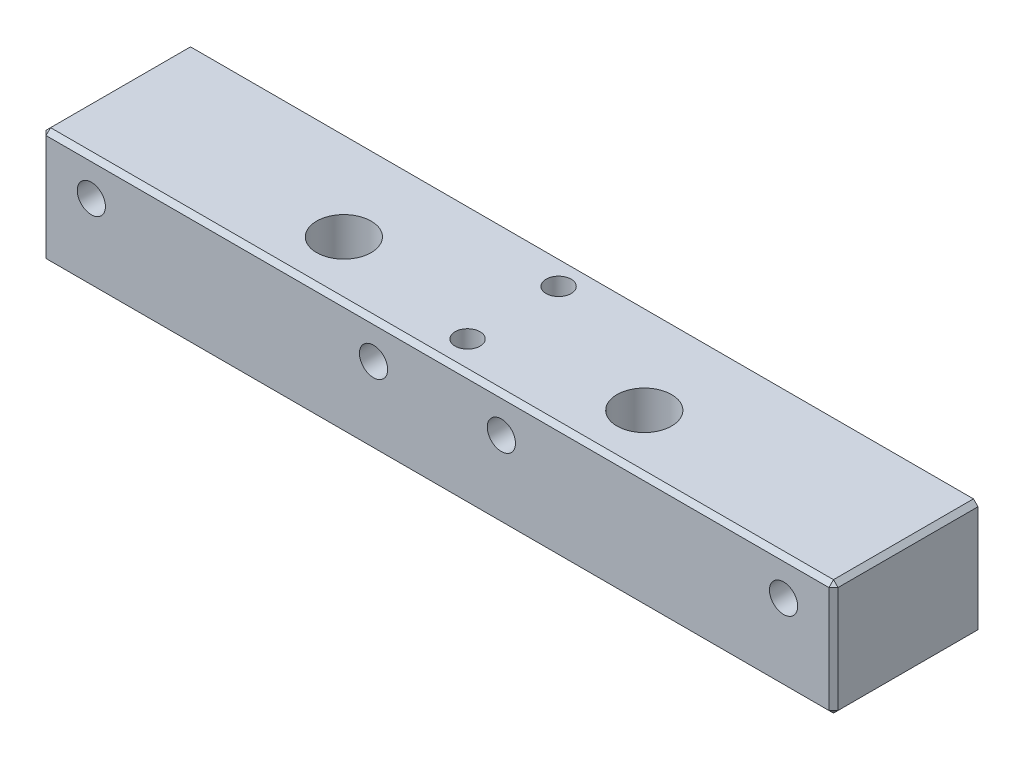
ISO-10303-21;
HEADER;
FILE_DESCRIPTION(('STEP AP214'),'2;1');
FILE_NAME('part.step','',(''),(''),'','','');
FILE_SCHEMA(('AUTOMOTIVE_DESIGN { 1 0 10303 214 1 1 1 1 }'));
ENDSEC;
DATA;
#1=APPLICATION_CONTEXT('core data for automotive mechanical design processes');
#2=APPLICATION_PROTOCOL_DEFINITION('international standard','automotive_design',2000,#1);
#3=PRODUCT_CONTEXT('',#1,'mechanical');
#4=PRODUCT('Part','Part','',(#3));
#5=PRODUCT_RELATED_PRODUCT_CATEGORY('part','',(#4));
#6=PRODUCT_DEFINITION_FORMATION('','',#4);
#7=PRODUCT_DEFINITION_CONTEXT('part definition',#1,'design');
#8=PRODUCT_DEFINITION('design','',#6,#7);
#9=PRODUCT_DEFINITION_SHAPE('','',#8);
#10=(LENGTH_UNIT() NAMED_UNIT(*) SI_UNIT(.MILLI.,.METRE.));
#11=(NAMED_UNIT(*) PLANE_ANGLE_UNIT() SI_UNIT($,.RADIAN.));
#12=(NAMED_UNIT(*) SI_UNIT($,.STERADIAN.) SOLID_ANGLE_UNIT());
#13=UNCERTAINTY_MEASURE_WITH_UNIT(LENGTH_MEASURE(1.E-05),#10,'distance_accuracy_value','');
#14=(GEOMETRIC_REPRESENTATION_CONTEXT(3) GLOBAL_UNCERTAINTY_ASSIGNED_CONTEXT((#13)) GLOBAL_UNIT_ASSIGNED_CONTEXT((#10,
#11,#12)) REPRESENTATION_CONTEXT('',''));
#15=CARTESIAN_POINT('',(0.,0.,0.));
#16=DIRECTION('',(0.,0.,1.));
#17=DIRECTION('',(1.,0.,0.));
#18=AXIS2_PLACEMENT_3D('',#15,#16,#17);
#19=CARTESIAN_POINT('',(-43.5,-6.35,7.9375));
#20=DIRECTION('',(0.,1.,0.));
#21=DIRECTION('',(0.,0.,1.));
#22=AXIS2_PLACEMENT_3D('',#19,#20,#21);
#23=PLANE('',#22);
#24=CARTESIAN_POINT('',(0.,-6.35,-5.3675));
#25=DIRECTION('',(0.,1.,0.));
#26=DIRECTION('',(0.,0.,1.));
#27=AXIS2_PLACEMENT_3D('',#24,#25,#26);
#28=CIRCLE('',#27,1.375);
#29=CARTESIAN_POINT('',(0.,-6.35,-3.9925));
#30=VERTEX_POINT('',#29);
#31=EDGE_CURVE('E340',#30,#30,#28,.T.);
#32=ORIENTED_EDGE('',*,*,#31,.T.);
#33=EDGE_LOOP('',(#32));
#34=FACE_BOUND('',#33,.T.);
#35=CARTESIAN_POINT('',(-37.,-6.35,-0.367500000000001));
#36=DIRECTION('',(0.,1.,0.));
#37=DIRECTION('',(0.,0.,1.));
#38=AXIS2_PLACEMENT_3D('',#35,#36,#37);
#39=CIRCLE('',#38,1.375);
#40=CARTESIAN_POINT('',(-37.,-6.35,1.0075));
#41=VERTEX_POINT('',#40);
#42=EDGE_CURVE('E349',#41,#41,#39,.T.);
#43=ORIENTED_EDGE('',*,*,#42,.T.);
#44=EDGE_LOOP('',(#43));
#45=FACE_BOUND('',#44,.T.);
#46=DIRECTION('',(1.,0.,0.));
#47=VECTOR('',#46,1.);
#48=CARTESIAN_POINT('',(-43.5,-6.35,-7.9375));
#49=LINE('',#48,#47);
#50=CARTESIAN_POINT('',(-43.,-6.34999999999999,-7.9375));
#51=VERTEX_POINT('',#50);
#52=CARTESIAN_POINT('',(43.,-6.35,-7.9375));
#53=VERTEX_POINT('',#52);
#54=EDGE_CURVE('E145',#51,#53,#49,.T.);
#55=ORIENTED_EDGE('',*,*,#54,.T.);
#56=DIRECTION('',(0.,0.,1.));
#57=VECTOR('',#56,1.);
#58=CARTESIAN_POINT('',(43.,-6.35,7.9375));
#59=LINE('',#58,#57);
#60=CARTESIAN_POINT('',(43.,-6.35,7.4375));
#61=VERTEX_POINT('',#60);
#62=EDGE_CURVE('E166',#53,#61,#59,.T.);
#63=ORIENTED_EDGE('',*,*,#62,.T.);
#64=DIRECTION('',(-1.,0.,0.));
#65=VECTOR('',#64,1.);
#66=CARTESIAN_POINT('',(-43.5,-6.35,7.4375));
#67=LINE('',#66,#65);
#68=CARTESIAN_POINT('',(-43.,-6.35,7.4375));
#69=VERTEX_POINT('',#68);
#70=EDGE_CURVE('E162',#61,#69,#67,.T.);
#71=ORIENTED_EDGE('',*,*,#70,.T.);
#72=DIRECTION('',(0.,0.,-1.));
#73=VECTOR('',#72,1.);
#74=CARTESIAN_POINT('',(-43.,-6.35,7.9375));
#75=LINE('',#74,#73);
#76=EDGE_CURVE('E164',#69,#51,#75,.T.);
#77=ORIENTED_EDGE('',*,*,#76,.T.);
#78=EDGE_LOOP('',(#55,#63,#71,#77));
#79=FACE_BOUND('',#78,.T.);
#80=CARTESIAN_POINT('',(-16.5,-6.35,1.7175));
#81=DIRECTION('',(0.,1.,0.));
#82=DIRECTION('',(0.,0.,1.));
#83=AXIS2_PLACEMENT_3D('',#80,#81,#82);
#84=CIRCLE('',#83,3.);
#85=CARTESIAN_POINT('',(-16.5,-6.35,4.7175));
#86=VERTEX_POINT('',#85);
#87=EDGE_CURVE('E242',#86,#86,#84,.T.);
#88=ORIENTED_EDGE('',*,*,#87,.T.);
#89=EDGE_LOOP('',(#88));
#90=FACE_BOUND('',#89,.T.);
#91=CARTESIAN_POINT('',(16.5,-6.35,1.7175));
#92=DIRECTION('',(0.,1.,0.));
#93=DIRECTION('',(0.,0.,1.));
#94=AXIS2_PLACEMENT_3D('',#91,#92,#93);
#95=CIRCLE('',#94,3.);
#96=CARTESIAN_POINT('',(16.5,-6.35,4.7175));
#97=VERTEX_POINT('',#96);
#98=EDGE_CURVE('E147',#97,#97,#95,.T.);
#99=ORIENTED_EDGE('',*,*,#98,.T.);
#100=EDGE_LOOP('',(#99));
#101=FACE_BOUND('',#100,.T.);
#102=CARTESIAN_POINT('',(37.,-6.35,-0.36750000000001));
#103=DIRECTION('',(0.,1.,0.));
#104=DIRECTION('',(0.,0.,-1.));
#105=AXIS2_PLACEMENT_3D('',#102,#103,#104);
#106=CIRCLE('',#105,1.375);
#107=CARTESIAN_POINT('',(37.,-6.35,-1.74250000000001));
#108=VERTEX_POINT('',#107);
#109=EDGE_CURVE('E345',#108,#108,#106,.T.);
#110=ORIENTED_EDGE('',*,*,#109,.T.);
#111=EDGE_LOOP('',(#110));
#112=FACE_BOUND('',#111,.T.);
#113=CARTESIAN_POINT('',(0.,-6.35,4.6325));
#114=DIRECTION('',(0.,1.,0.));
#115=DIRECTION('',(0.,0.,1.));
#116=AXIS2_PLACEMENT_3D('',#113,#114,#115);
#117=CIRCLE('',#116,1.375);
#118=CARTESIAN_POINT('',(0.,-6.35,6.0075));
#119=VERTEX_POINT('',#118);
#120=EDGE_CURVE('E334',#119,#119,#117,.T.);
#121=ORIENTED_EDGE('',*,*,#120,.T.);
#122=EDGE_LOOP('',(#121));
#123=FACE_BOUND('',#122,.T.);
#124=ADVANCED_FACE('F33',(#34,#45,#79,#90,#101,#112,#123),#23,.F.);
#125=CARTESIAN_POINT('',(43.5,-6.35,7.9375));
#126=DIRECTION('',(-1.,0.,0.));
#127=DIRECTION('',(0.,0.,1.));
#128=AXIS2_PLACEMENT_3D('',#125,#126,#127);
#129=PLANE('',#128);
#130=DIRECTION('',(0.,1.,0.));
#131=VECTOR('',#130,1.);
#132=CARTESIAN_POINT('',(43.5,-6.35,-7.9375));
#133=LINE('',#132,#131);
#134=CARTESIAN_POINT('',(43.5,-5.85,-7.9375));
#135=VERTEX_POINT('',#134);
#136=CARTESIAN_POINT('',(43.5,5.85,-7.9375));
#137=VERTEX_POINT('',#136);
#138=EDGE_CURVE('E142',#135,#137,#133,.T.);
#139=ORIENTED_EDGE('',*,*,#138,.T.);
#140=DIRECTION('',(0.,0.,1.));
#141=VECTOR('',#140,1.);
#142=CARTESIAN_POINT('',(43.5,5.85,7.9375));
#143=LINE('',#142,#141);
#144=CARTESIAN_POINT('',(43.5,5.85,7.4375));
#145=VERTEX_POINT('',#144);
#146=EDGE_CURVE('E119',#137,#145,#143,.T.);
#147=ORIENTED_EDGE('',*,*,#146,.T.);
#148=DIRECTION('',(0.,-1.,0.));
#149=VECTOR('',#148,1.);
#150=CARTESIAN_POINT('',(43.5,-6.35,7.4375));
#151=LINE('',#150,#149);
#152=CARTESIAN_POINT('',(43.5,-5.85,7.4375));
#153=VERTEX_POINT('',#152);
#154=EDGE_CURVE('E124',#145,#153,#151,.T.);
#155=ORIENTED_EDGE('',*,*,#154,.T.);
#156=DIRECTION('',(0.,0.,-1.));
#157=VECTOR('',#156,1.);
#158=CARTESIAN_POINT('',(43.5,-5.85,7.9375));
#159=LINE('',#158,#157);
#160=EDGE_CURVE('E159',#153,#135,#159,.T.);
#161=ORIENTED_EDGE('',*,*,#160,.T.);
#162=EDGE_LOOP('',(#139,#147,#155,#161));
#163=FACE_BOUND('',#162,.T.);
#164=ADVANCED_FACE('F256',(#163),#129,.F.);
#165=CARTESIAN_POINT('',(-43.5,6.35,7.9375));
#166=DIRECTION('',(0.,-1.,0.));
#167=DIRECTION('',(0.,0.,-1.));
#168=AXIS2_PLACEMENT_3D('',#165,#166,#167);
#169=PLANE('',#168);
#170=CARTESIAN_POINT('',(0.,6.35000000000001,-5.3675));
#171=DIRECTION('',(0.,-1.,0.));
#172=DIRECTION('',(0.,0.,-1.));
#173=AXIS2_PLACEMENT_3D('',#170,#171,#172);
#174=CIRCLE('',#173,1.375);
#175=CARTESIAN_POINT('',(0.,6.35000000000001,-6.7425));
#176=VERTEX_POINT('',#175);
#177=EDGE_CURVE('E338',#176,#176,#174,.T.);
#178=ORIENTED_EDGE('',*,*,#177,.T.);
#179=EDGE_LOOP('',(#178));
#180=FACE_BOUND('',#179,.T.);
#181=CARTESIAN_POINT('',(0.,6.35000000000001,4.6325));
#182=DIRECTION('',(0.,-1.,0.));
#183=DIRECTION('',(0.,0.,-1.));
#184=AXIS2_PLACEMENT_3D('',#181,#182,#183);
#185=CIRCLE('',#184,1.375);
#186=CARTESIAN_POINT('',(0.,6.35000000000001,3.2575));
#187=VERTEX_POINT('',#186);
#188=EDGE_CURVE('E337',#187,#187,#185,.T.);
#189=ORIENTED_EDGE('',*,*,#188,.T.);
#190=EDGE_LOOP('',(#189));
#191=FACE_BOUND('',#190,.T.);
#192=CARTESIAN_POINT('',(-16.5,6.35,1.7175));
#193=DIRECTION('',(0.,1.,0.));
#194=DIRECTION('',(0.,0.,1.));
#195=AXIS2_PLACEMENT_3D('',#192,#193,#194);
#196=CIRCLE('',#195,3.);
#197=CARTESIAN_POINT('',(-16.5,6.35,4.7175));
#198=VERTEX_POINT('',#197);
#199=EDGE_CURVE('E239',#198,#198,#196,.T.);
#200=ORIENTED_EDGE('',*,*,#199,.F.);
#201=EDGE_LOOP('',(#200));
#202=FACE_BOUND('',#201,.T.);
#203=CARTESIAN_POINT('',(16.5,6.35,1.7175));
#204=DIRECTION('',(0.,1.,0.));
#205=DIRECTION('',(0.,0.,1.));
#206=AXIS2_PLACEMENT_3D('',#203,#204,#205);
#207=CIRCLE('',#206,3.);
#208=CARTESIAN_POINT('',(16.5,6.35,4.7175));
#209=VERTEX_POINT('',#208);
#210=EDGE_CURVE('E245',#209,#209,#207,.T.);
#211=ORIENTED_EDGE('',*,*,#210,.F.);
#212=EDGE_LOOP('',(#211));
#213=FACE_BOUND('',#212,.T.);
#214=DIRECTION('',(1.,0.,0.));
#215=VECTOR('',#214,1.);
#216=CARTESIAN_POINT('',(-43.5,6.35,7.4375));
#217=LINE('',#216,#215);
#218=CARTESIAN_POINT('',(-43.,6.35,7.4375));
#219=VERTEX_POINT('',#218);
#220=CARTESIAN_POINT('',(43.,6.35,7.4375));
#221=VERTEX_POINT('',#220);
#222=EDGE_CURVE('E133',#219,#221,#217,.T.);
#223=ORIENTED_EDGE('',*,*,#222,.T.);
#224=DIRECTION('',(0.,0.,-1.));
#225=VECTOR('',#224,1.);
#226=CARTESIAN_POINT('',(43.,6.35,7.9375));
#227=LINE('',#226,#225);
#228=CARTESIAN_POINT('',(43.,6.35000000000001,-7.9375));
#229=VERTEX_POINT('',#228);
#230=EDGE_CURVE('E118',#221,#229,#227,.T.);
#231=ORIENTED_EDGE('',*,*,#230,.T.);
#232=DIRECTION('',(-1.,0.,0.));
#233=VECTOR('',#232,1.);
#234=CARTESIAN_POINT('',(-43.5,6.35,-7.9375));
#235=LINE('',#234,#233);
#236=CARTESIAN_POINT('',(-43.,6.35,-7.9375));
#237=VERTEX_POINT('',#236);
#238=EDGE_CURVE('E130',#229,#237,#235,.T.);
#239=ORIENTED_EDGE('',*,*,#238,.T.);
#240=DIRECTION('',(0.,0.,1.));
#241=VECTOR('',#240,1.);
#242=CARTESIAN_POINT('',(-43.,6.35,7.9375));
#243=LINE('',#242,#241);
#244=EDGE_CURVE('E135',#237,#219,#243,.T.);
#245=ORIENTED_EDGE('',*,*,#244,.T.);
#246=EDGE_LOOP('',(#223,#231,#239,#245));
#247=FACE_BOUND('',#246,.T.);
#248=ADVANCED_FACE('F129',(#180,#191,#202,#213,#247),#169,.F.);
#249=CARTESIAN_POINT('',(-43.5,-6.35,7.9375));
#250=DIRECTION('',(1.,0.,0.));
#251=DIRECTION('',(0.,0.,-1.));
#252=AXIS2_PLACEMENT_3D('',#249,#250,#251);
#253=PLANE('',#252);
#254=DIRECTION('',(0.,1.,0.));
#255=VECTOR('',#254,1.);
#256=CARTESIAN_POINT('',(-43.5,-6.35,7.4375));
#257=LINE('',#256,#255);
#258=CARTESIAN_POINT('',(-43.5,-5.85,7.4375));
#259=VERTEX_POINT('',#258);
#260=CARTESIAN_POINT('',(-43.5,5.85,7.4375));
#261=VERTEX_POINT('',#260);
#262=EDGE_CURVE('E168',#259,#261,#257,.T.);
#263=ORIENTED_EDGE('',*,*,#262,.T.);
#264=DIRECTION('',(0.,0.,-1.));
#265=VECTOR('',#264,1.);
#266=CARTESIAN_POINT('',(-43.5,5.85,7.9375));
#267=LINE('',#266,#265);
#268=CARTESIAN_POINT('',(-43.5,5.85,-7.9375));
#269=VERTEX_POINT('',#268);
#270=EDGE_CURVE('E172',#261,#269,#267,.T.);
#271=ORIENTED_EDGE('',*,*,#270,.T.);
#272=DIRECTION('',(0.,-1.,0.));
#273=VECTOR('',#272,1.);
#274=CARTESIAN_POINT('',(-43.5,-6.35,-7.9375));
#275=LINE('',#274,#273);
#276=CARTESIAN_POINT('',(-43.5,-5.85,-7.9375));
#277=VERTEX_POINT('',#276);
#278=EDGE_CURVE('E141',#269,#277,#275,.T.);
#279=ORIENTED_EDGE('',*,*,#278,.T.);
#280=DIRECTION('',(0.,0.,1.));
#281=VECTOR('',#280,1.);
#282=CARTESIAN_POINT('',(-43.5,-5.85,7.9375));
#283=LINE('',#282,#281);
#284=EDGE_CURVE('E170',#277,#259,#283,.T.);
#285=ORIENTED_EDGE('',*,*,#284,.T.);
#286=EDGE_LOOP('',(#263,#271,#279,#285));
#287=FACE_BOUND('',#286,.T.);
#288=ADVANCED_FACE('F255',(#287),#253,.F.);
#289=CARTESIAN_POINT('',(43.5,6.35,7.9375));
#290=DIRECTION('',(0.,0.,-1.));
#291=DIRECTION('',(-1.,0.,0.));
#292=AXIS2_PLACEMENT_3D('',#289,#290,#291);
#293=PLANE('',#292);
#294=DIRECTION('',(1.,0.,0.));
#295=VECTOR('',#294,1.);
#296=CARTESIAN_POINT('',(43.5,-5.85,7.9375));
#297=LINE('',#296,#295);
#298=CARTESIAN_POINT('',(-43.,-5.85,7.9375));
#299=VERTEX_POINT('',#298);
#300=CARTESIAN_POINT('',(43.,-5.85,7.9375));
#301=VERTEX_POINT('',#300);
#302=EDGE_CURVE('E57',#299,#301,#297,.T.);
#303=ORIENTED_EDGE('',*,*,#302,.T.);
#304=DIRECTION('',(0.,1.,0.));
#305=VECTOR('',#304,1.);
#306=CARTESIAN_POINT('',(43.,6.35,7.9375));
#307=LINE('',#306,#305);
#308=CARTESIAN_POINT('',(43.,5.85,7.9375));
#309=VERTEX_POINT('',#308);
#310=EDGE_CURVE('E11',#301,#309,#307,.T.);
#311=ORIENTED_EDGE('',*,*,#310,.T.);
#312=DIRECTION('',(-1.,0.,0.));
#313=VECTOR('',#312,1.);
#314=CARTESIAN_POINT('',(43.5,5.85,7.9375));
#315=LINE('',#314,#313);
#316=CARTESIAN_POINT('',(-43.,5.85,7.9375));
#317=VERTEX_POINT('',#316);
#318=EDGE_CURVE('E42',#309,#317,#315,.T.);
#319=ORIENTED_EDGE('',*,*,#318,.T.);
#320=DIRECTION('',(0.,-1.,0.));
#321=VECTOR('',#320,1.);
#322=CARTESIAN_POINT('',(-43.,6.35,7.9375));
#323=LINE('',#322,#321);
#324=EDGE_CURVE('E174',#317,#299,#323,.T.);
#325=ORIENTED_EDGE('',*,*,#324,.T.);
#326=EDGE_LOOP('',(#303,#311,#319,#325));
#327=FACE_BOUND('',#326,.T.);
#328=CARTESIAN_POINT('',(38.02,2.35000000000001,7.9375));
#329=DIRECTION('',(0.,0.,1.));
#330=DIRECTION('',(1.,0.,0.));
#331=AXIS2_PLACEMENT_3D('',#328,#329,#330);
#332=CIRCLE('',#331,1.55);
#333=CARTESIAN_POINT('',(39.57,2.35000000000001,7.9375));
#334=VERTEX_POINT('',#333);
#335=EDGE_CURVE('E210',#334,#334,#332,.T.);
#336=ORIENTED_EDGE('',*,*,#335,.F.);
#337=EDGE_LOOP('',(#336));
#338=FACE_BOUND('',#337,.T.);
#339=CARTESIAN_POINT('',(-7.02,2.35,7.9375));
#340=DIRECTION('',(0.,0.,1.));
#341=DIRECTION('',(1.,0.,0.));
#342=AXIS2_PLACEMENT_3D('',#339,#340,#341);
#343=CIRCLE('',#342,1.55);
#344=CARTESIAN_POINT('',(-5.47,2.35,7.9375));
#345=VERTEX_POINT('',#344);
#346=EDGE_CURVE('E220',#345,#345,#343,.T.);
#347=ORIENTED_EDGE('',*,*,#346,.F.);
#348=EDGE_LOOP('',(#347));
#349=FACE_BOUND('',#348,.T.);
#350=CARTESIAN_POINT('',(7.02,2.35000000000001,7.9375));
#351=DIRECTION('',(0.,0.,1.));
#352=DIRECTION('',(1.,0.,0.));
#353=AXIS2_PLACEMENT_3D('',#350,#351,#352);
#354=CIRCLE('',#353,1.55);
#355=CARTESIAN_POINT('',(8.57,2.35000000000001,7.9375));
#356=VERTEX_POINT('',#355);
#357=EDGE_CURVE('E227',#356,#356,#354,.T.);
#358=ORIENTED_EDGE('',*,*,#357,.F.);
#359=EDGE_LOOP('',(#358));
#360=FACE_BOUND('',#359,.T.);
#361=CARTESIAN_POINT('',(-38.02,2.35,7.9375));
#362=DIRECTION('',(0.,0.,1.));
#363=DIRECTION('',(1.,0.,0.));
#364=AXIS2_PLACEMENT_3D('',#361,#362,#363);
#365=CIRCLE('',#364,1.55);
#366=CARTESIAN_POINT('',(-36.47,2.35,7.9375));
#367=VERTEX_POINT('',#366);
#368=EDGE_CURVE('E233',#367,#367,#365,.T.);
#369=ORIENTED_EDGE('',*,*,#368,.F.);
#370=EDGE_LOOP('',(#369));
#371=FACE_BOUND('',#370,.T.);
#372=ADVANCED_FACE('F263',(#327,#338,#349,#360,#371),#293,.F.);
#373=CARTESIAN_POINT('',(43.5,6.35,-7.9375));
#374=DIRECTION('',(0.,0.,-1.));
#375=DIRECTION('',(-1.,0.,0.));
#376=AXIS2_PLACEMENT_3D('',#373,#374,#375);
#377=PLANE('',#376);
#378=CARTESIAN_POINT('',(38.02,2.35000000000001,-7.9375));
#379=DIRECTION('',(0.,0.,1.));
#380=DIRECTION('',(1.,0.,0.));
#381=AXIS2_PLACEMENT_3D('',#378,#379,#380);
#382=CIRCLE('',#381,1.55);
#383=CARTESIAN_POINT('',(39.57,2.35000000000001,-7.9375));
#384=VERTEX_POINT('',#383);
#385=EDGE_CURVE('E215',#384,#384,#382,.T.);
#386=ORIENTED_EDGE('',*,*,#385,.T.);
#387=EDGE_LOOP('',(#386));
#388=FACE_BOUND('',#387,.T.);
#389=CARTESIAN_POINT('',(-7.02,2.35,-7.9375));
#390=DIRECTION('',(0.,0.,1.));
#391=DIRECTION('',(1.,0.,0.));
#392=AXIS2_PLACEMENT_3D('',#389,#390,#391);
#393=CIRCLE('',#392,1.55);
#394=CARTESIAN_POINT('',(-5.47,2.35,-7.9375));
#395=VERTEX_POINT('',#394);
#396=EDGE_CURVE('E224',#395,#395,#393,.T.);
#397=ORIENTED_EDGE('',*,*,#396,.T.);
#398=EDGE_LOOP('',(#397));
#399=FACE_BOUND('',#398,.T.);
#400=CARTESIAN_POINT('',(7.02,2.35000000000001,-7.9375));
#401=DIRECTION('',(0.,0.,1.));
#402=DIRECTION('',(1.,0.,0.));
#403=AXIS2_PLACEMENT_3D('',#400,#401,#402);
#404=CIRCLE('',#403,1.55);
#405=CARTESIAN_POINT('',(8.57,2.35000000000001,-7.9375));
#406=VERTEX_POINT('',#405);
#407=EDGE_CURVE('E230',#406,#406,#404,.T.);
#408=ORIENTED_EDGE('',*,*,#407,.T.);
#409=EDGE_LOOP('',(#408));
#410=FACE_BOUND('',#409,.T.);
#411=CARTESIAN_POINT('',(-38.02,2.35,-7.9375));
#412=DIRECTION('',(0.,0.,1.));
#413=DIRECTION('',(1.,0.,0.));
#414=AXIS2_PLACEMENT_3D('',#411,#412,#413);
#415=CIRCLE('',#414,1.55);
#416=CARTESIAN_POINT('',(-36.47,2.35,-7.9375));
#417=VERTEX_POINT('',#416);
#418=EDGE_CURVE('E236',#417,#417,#415,.T.);
#419=ORIENTED_EDGE('',*,*,#418,.T.);
#420=EDGE_LOOP('',(#419));
#421=FACE_BOUND('',#420,.T.);
#422=ORIENTED_EDGE('',*,*,#238,.F.);
#423=DIRECTION('',(-0.707106781186548,0.707106781186548,0.));
#424=VECTOR('',#423,1.);
#425=CARTESIAN_POINT('',(43.25,6.1,-7.9375));
#426=LINE('',#425,#424);
#427=EDGE_CURVE('E114',#229,#137,#426,.F.);
#428=ORIENTED_EDGE('',*,*,#427,.T.);
#429=ORIENTED_EDGE('',*,*,#138,.F.);
#430=DIRECTION('',(0.707106781186548,0.707106781186548,0.));
#431=VECTOR('',#430,1.);
#432=CARTESIAN_POINT('',(49.6,0.250000000000001,-7.9375));
#433=LINE('',#432,#431);
#434=EDGE_CURVE('E125',#135,#53,#433,.F.);
#435=ORIENTED_EDGE('',*,*,#434,.T.);
#436=ORIENTED_EDGE('',*,*,#54,.F.);
#437=DIRECTION('',(0.707106781186548,-0.707106781186548,0.));
#438=VECTOR('',#437,1.);
#439=CARTESIAN_POINT('',(-6.1,-43.25,-7.9375));
#440=LINE('',#439,#438);
#441=EDGE_CURVE('E134',#51,#277,#440,.F.);
#442=ORIENTED_EDGE('',*,*,#441,.T.);
#443=ORIENTED_EDGE('',*,*,#278,.F.);
#444=DIRECTION('',(-0.707106781186548,-0.707106781186548,0.));
#445=VECTOR('',#444,1.);
#446=CARTESIAN_POINT('',(0.249999999999993,49.6,-7.9375));
#447=LINE('',#446,#445);
#448=EDGE_CURVE('E140',#269,#237,#447,.F.);
#449=ORIENTED_EDGE('',*,*,#448,.T.);
#450=EDGE_LOOP('',(#422,#428,#429,#435,#436,#442,#443,#449));
#451=FACE_BOUND('',#450,.T.);
#452=ADVANCED_FACE('F137',(#388,#399,#410,#421,#451),#377,.T.);
#453=CARTESIAN_POINT('',(16.5,-6.35,1.7175));
#454=DIRECTION('',(0.,1.,0.));
#455=DIRECTION('',(0.,0.,1.));
#456=AXIS2_PLACEMENT_3D('',#453,#454,#455);
#457=CYLINDRICAL_SURFACE('',#456,3.);
#458=ORIENTED_EDGE('',*,*,#98,.F.);
#459=EDGE_LOOP('',(#458));
#460=FACE_BOUND('',#459,.T.);
#461=ORIENTED_EDGE('',*,*,#210,.T.);
#462=EDGE_LOOP('',(#461));
#463=FACE_BOUND('',#462,.T.);
#464=ADVANCED_FACE('F252',(#460,#463),#457,.F.);
#465=CARTESIAN_POINT('',(-16.5,-6.35,1.7175));
#466=DIRECTION('',(0.,1.,0.));
#467=DIRECTION('',(0.,0.,1.));
#468=AXIS2_PLACEMENT_3D('',#465,#466,#467);
#469=CYLINDRICAL_SURFACE('',#468,3.);
#470=ORIENTED_EDGE('',*,*,#87,.F.);
#471=EDGE_LOOP('',(#470));
#472=FACE_BOUND('',#471,.T.);
#473=ORIENTED_EDGE('',*,*,#199,.T.);
#474=EDGE_LOOP('',(#473));
#475=FACE_BOUND('',#474,.T.);
#476=ADVANCED_FACE('F285',(#472,#475),#469,.F.);
#477=CARTESIAN_POINT('',(-38.02,2.35,-7.9375));
#478=DIRECTION('',(0.,0.,1.));
#479=DIRECTION('',(1.,0.,0.));
#480=AXIS2_PLACEMENT_3D('',#477,#478,#479);
#481=CYLINDRICAL_SURFACE('',#480,1.55);
#482=ORIENTED_EDGE('',*,*,#418,.F.);
#483=EDGE_LOOP('',(#482));
#484=FACE_BOUND('',#483,.T.);
#485=ORIENTED_EDGE('',*,*,#368,.T.);
#486=EDGE_LOOP('',(#485));
#487=FACE_BOUND('',#486,.T.);
#488=ADVANCED_FACE('F289',(#484,#487),#481,.F.);
#489=CARTESIAN_POINT('',(7.02,2.35000000000001,-7.9375));
#490=DIRECTION('',(0.,0.,1.));
#491=DIRECTION('',(1.,0.,0.));
#492=AXIS2_PLACEMENT_3D('',#489,#490,#491);
#493=CYLINDRICAL_SURFACE('',#492,1.55);
#494=ORIENTED_EDGE('',*,*,#407,.F.);
#495=EDGE_LOOP('',(#494));
#496=FACE_BOUND('',#495,.T.);
#497=ORIENTED_EDGE('',*,*,#357,.T.);
#498=EDGE_LOOP('',(#497));
#499=FACE_BOUND('',#498,.T.);
#500=ADVANCED_FACE('F293',(#496,#499),#493,.F.);
#501=CARTESIAN_POINT('',(-7.02,2.35,-7.9375));
#502=DIRECTION('',(0.,0.,1.));
#503=DIRECTION('',(1.,0.,0.));
#504=AXIS2_PLACEMENT_3D('',#501,#502,#503);
#505=CYLINDRICAL_SURFACE('',#504,1.55);
#506=ORIENTED_EDGE('',*,*,#396,.F.);
#507=EDGE_LOOP('',(#506));
#508=FACE_BOUND('',#507,.T.);
#509=ORIENTED_EDGE('',*,*,#346,.T.);
#510=EDGE_LOOP('',(#509));
#511=FACE_BOUND('',#510,.T.);
#512=ADVANCED_FACE('F297',(#508,#511),#505,.F.);
#513=CARTESIAN_POINT('',(38.02,2.35000000000001,-7.9375));
#514=DIRECTION('',(0.,0.,1.));
#515=DIRECTION('',(1.,0.,0.));
#516=AXIS2_PLACEMENT_3D('',#513,#514,#515);
#517=CYLINDRICAL_SURFACE('',#516,1.55);
#518=ORIENTED_EDGE('',*,*,#385,.F.);
#519=EDGE_LOOP('',(#518));
#520=FACE_BOUND('',#519,.T.);
#521=ORIENTED_EDGE('',*,*,#335,.T.);
#522=EDGE_LOOP('',(#521));
#523=FACE_BOUND('',#522,.T.);
#524=ADVANCED_FACE('F301',(#520,#523),#517,.F.);
#525=CARTESIAN_POINT('',(-43.,-6.35,7.9375));
#526=DIRECTION('',(0.707106781186547,0.707106781186547,0.));
#527=DIRECTION('',(-0.707106781186548,0.707106781186548,0.));
#528=AXIS2_PLACEMENT_3D('',#525,#526,#527);
#529=PLANE('',#528);
#530=DIRECTION('',(-0.707106781186547,0.707106781186547,0.));
#531=VECTOR('',#530,1.);
#532=CARTESIAN_POINT('',(-43.5,-5.85,7.4375));
#533=LINE('',#532,#531);
#534=EDGE_CURVE('E37',#259,#69,#533,.F.);
#535=ORIENTED_EDGE('',*,*,#534,.F.);
#536=ORIENTED_EDGE('',*,*,#284,.F.);
#537=ORIENTED_EDGE('',*,*,#441,.F.);
#538=ORIENTED_EDGE('',*,*,#76,.F.);
#539=EDGE_LOOP('',(#535,#536,#537,#538));
#540=FACE_BOUND('',#539,.T.);
#541=ADVANCED_FACE('F35',(#540),#529,.F.);
#542=CARTESIAN_POINT('',(-43.5,-5.85,7.4375));
#543=DIRECTION('',(-0.577350269189626,-0.577350269189626,0.577350269189626));
#544=DIRECTION('',(0.707106781186547,0.,0.707106781186547));
#545=AXIS2_PLACEMENT_3D('',#542,#543,#544);
#546=PLANE('',#545);
#547=DIRECTION('',(0.707106781186547,0.,0.707106781186547));
#548=VECTOR('',#547,1.);
#549=CARTESIAN_POINT('',(-43.5,-5.85,7.4375));
#550=LINE('',#549,#548);
#551=EDGE_CURVE('E202',#259,#299,#550,.T.);
#552=ORIENTED_EDGE('',*,*,#551,.F.);
#553=ORIENTED_EDGE('',*,*,#534,.T.);
#554=DIRECTION('',(0.,-0.707106781186547,-0.707106781186547));
#555=VECTOR('',#554,1.);
#556=CARTESIAN_POINT('',(-43.,-6.1,7.6875));
#557=LINE('',#556,#555);
#558=EDGE_CURVE('E204',#299,#69,#557,.T.);
#559=ORIENTED_EDGE('',*,*,#558,.F.);
#560=EDGE_LOOP('',(#552,#553,#559));
#561=FACE_BOUND('',#560,.T.);
#562=ADVANCED_FACE('F404',(#561),#546,.T.);
#563=CARTESIAN_POINT('',(43.5,-5.85,7.9375));
#564=DIRECTION('',(-0.707106781186547,0.707106781186547,0.));
#565=DIRECTION('',(-0.707106781186548,-0.707106781186548,0.));
#566=AXIS2_PLACEMENT_3D('',#563,#564,#565);
#567=PLANE('',#566);
#568=ORIENTED_EDGE('',*,*,#434,.F.);
#569=ORIENTED_EDGE('',*,*,#160,.F.);
#570=DIRECTION('',(-0.707106781186547,-0.707106781186547,0.));
#571=VECTOR('',#570,1.);
#572=CARTESIAN_POINT('',(43.,-6.35,7.4375));
#573=LINE('',#572,#571);
#574=EDGE_CURVE('E199',#61,#153,#573,.F.);
#575=ORIENTED_EDGE('',*,*,#574,.F.);
#576=ORIENTED_EDGE('',*,*,#62,.F.);
#577=EDGE_LOOP('',(#568,#569,#575,#576));
#578=FACE_BOUND('',#577,.T.);
#579=ADVANCED_FACE('F375',(#578),#567,.F.);
#580=CARTESIAN_POINT('',(43.5,-5.85,7.9375));
#581=DIRECTION('',(0.,0.707106781186547,-0.707106781186547));
#582=DIRECTION('',(0.,0.707106781186548,0.707106781186548));
#583=AXIS2_PLACEMENT_3D('',#580,#581,#582);
#584=PLANE('',#583);
#585=ORIENTED_EDGE('',*,*,#558,.T.);
#586=ORIENTED_EDGE('',*,*,#70,.F.);
#587=DIRECTION('',(0.,0.707106781186547,0.707106781186547));
#588=VECTOR('',#587,1.);
#589=CARTESIAN_POINT('',(43.,-6.35,7.4375));
#590=LINE('',#589,#588);
#591=EDGE_CURVE('E196',#301,#61,#590,.F.);
#592=ORIENTED_EDGE('',*,*,#591,.F.);
#593=ORIENTED_EDGE('',*,*,#302,.F.);
#594=EDGE_LOOP('',(#585,#586,#592,#593));
#595=FACE_BOUND('',#594,.T.);
#596=ADVANCED_FACE('F381',(#595),#584,.F.);
#597=CARTESIAN_POINT('',(-43.,6.35,7.9375));
#598=DIRECTION('',(0.707106781186547,0.,-0.707106781186547));
#599=DIRECTION('',(-0.707106781186548,0.,-0.707106781186548));
#600=AXIS2_PLACEMENT_3D('',#597,#598,#599);
#601=PLANE('',#600);
#602=ORIENTED_EDGE('',*,*,#551,.T.);
#603=ORIENTED_EDGE('',*,*,#324,.F.);
#604=DIRECTION('',(-0.707106781186547,0.,-0.707106781186547));
#605=VECTOR('',#604,1.);
#606=CARTESIAN_POINT('',(-43.25,5.85,7.6875));
#607=LINE('',#606,#605);
#608=EDGE_CURVE('E193',#261,#317,#607,.F.);
#609=ORIENTED_EDGE('',*,*,#608,.F.);
#610=ORIENTED_EDGE('',*,*,#262,.F.);
#611=EDGE_LOOP('',(#602,#603,#609,#610));
#612=FACE_BOUND('',#611,.T.);
#613=ADVANCED_FACE('F393',(#612),#601,.F.);
#614=CARTESIAN_POINT('',(-43.5,5.85,7.9375));
#615=DIRECTION('',(0.707106781186547,-0.707106781186547,0.));
#616=DIRECTION('',(0.707106781186548,0.707106781186548,0.));
#617=AXIS2_PLACEMENT_3D('',#614,#615,#616);
#618=PLANE('',#617);
#619=ORIENTED_EDGE('',*,*,#448,.F.);
#620=ORIENTED_EDGE('',*,*,#270,.F.);
#621=DIRECTION('',(0.707106781186547,0.707106781186547,0.));
#622=VECTOR('',#621,1.);
#623=CARTESIAN_POINT('',(-43.,6.35,7.4375));
#624=LINE('',#623,#622);
#625=EDGE_CURVE('E190',#219,#261,#624,.F.);
#626=ORIENTED_EDGE('',*,*,#625,.F.);
#627=ORIENTED_EDGE('',*,*,#244,.F.);
#628=EDGE_LOOP('',(#619,#620,#626,#627));
#629=FACE_BOUND('',#628,.T.);
#630=ADVANCED_FACE('F389',(#629),#618,.F.);
#631=CARTESIAN_POINT('',(43.,-6.35,7.4375));
#632=DIRECTION('',(0.577350269189626,-0.577350269189626,0.577350269189626));
#633=DIRECTION('',(0.707106781186547,0.,-0.707106781186547));
#634=AXIS2_PLACEMENT_3D('',#631,#632,#633);
#635=PLANE('',#634);
#636=ORIENTED_EDGE('',*,*,#591,.T.);
#637=ORIENTED_EDGE('',*,*,#574,.T.);
#638=DIRECTION('',(0.707106781186547,0.,-0.707106781186547));
#639=VECTOR('',#638,1.);
#640=CARTESIAN_POINT('',(43.25,-5.85,7.6875));
#641=LINE('',#640,#639);
#642=EDGE_CURVE('E187',#301,#153,#641,.T.);
#643=ORIENTED_EDGE('',*,*,#642,.F.);
#644=EDGE_LOOP('',(#636,#637,#643));
#645=FACE_BOUND('',#644,.T.);
#646=ADVANCED_FACE('F379',(#645),#635,.T.);
#647=CARTESIAN_POINT('',(-43.,6.35,7.4375));
#648=DIRECTION('',(-0.577350269189626,0.577350269189626,0.577350269189626));
#649=DIRECTION('',(0.707106781186547,0.,0.707106781186547));
#650=AXIS2_PLACEMENT_3D('',#647,#648,#649);
#651=PLANE('',#650);
#652=ORIENTED_EDGE('',*,*,#625,.T.);
#653=ORIENTED_EDGE('',*,*,#608,.T.);
#654=DIRECTION('',(0.,-0.707106781186547,0.707106781186547));
#655=VECTOR('',#654,1.);
#656=CARTESIAN_POINT('',(-43.,6.35,7.4375));
#657=LINE('',#656,#655);
#658=EDGE_CURVE('E184',#219,#317,#657,.T.);
#659=ORIENTED_EDGE('',*,*,#658,.F.);
#660=EDGE_LOOP('',(#652,#653,#659));
#661=FACE_BOUND('',#660,.T.);
#662=ADVANCED_FACE('F395',(#661),#651,.T.);
#663=CARTESIAN_POINT('',(43.,6.35,7.9375));
#664=DIRECTION('',(-0.707106781186547,0.,-0.707106781186547));
#665=DIRECTION('',(-0.707106781186548,0.,0.707106781186548));
#666=AXIS2_PLACEMENT_3D('',#663,#664,#665);
#667=PLANE('',#666);
#668=ORIENTED_EDGE('',*,*,#642,.T.);
#669=ORIENTED_EDGE('',*,*,#154,.F.);
#670=DIRECTION('',(-0.707106781186547,0.,0.707106781186547));
#671=VECTOR('',#670,1.);
#672=CARTESIAN_POINT('',(43.5,5.85,7.4375));
#673=LINE('',#672,#671);
#674=EDGE_CURVE('E182',#309,#145,#673,.F.);
#675=ORIENTED_EDGE('',*,*,#674,.F.);
#676=ORIENTED_EDGE('',*,*,#310,.F.);
#677=EDGE_LOOP('',(#668,#669,#675,#676));
#678=FACE_BOUND('',#677,.T.);
#679=ADVANCED_FACE('F402',(#678),#667,.F.);
#680=CARTESIAN_POINT('',(43.5,5.85,7.9375));
#681=DIRECTION('',(0.,-0.707106781186547,-0.707106781186547));
#682=DIRECTION('',(0.,0.707106781186548,-0.707106781186548));
#683=AXIS2_PLACEMENT_3D('',#680,#681,#682);
#684=PLANE('',#683);
#685=ORIENTED_EDGE('',*,*,#658,.T.);
#686=ORIENTED_EDGE('',*,*,#318,.F.);
#687=DIRECTION('',(0.,0.707106781186547,-0.707106781186547));
#688=VECTOR('',#687,1.);
#689=CARTESIAN_POINT('',(43.,6.1,7.6875));
#690=LINE('',#689,#688);
#691=EDGE_CURVE('E50',#221,#309,#690,.F.);
#692=ORIENTED_EDGE('',*,*,#691,.F.);
#693=ORIENTED_EDGE('',*,*,#222,.F.);
#694=EDGE_LOOP('',(#685,#686,#692,#693));
#695=FACE_BOUND('',#694,.T.);
#696=ADVANCED_FACE('F398',(#695),#684,.F.);
#697=CARTESIAN_POINT('',(43.5,5.85,7.4375));
#698=DIRECTION('',(0.577350269189626,0.577350269189626,0.577350269189626));
#699=DIRECTION('',(0.707106781186547,0.,-0.707106781186547));
#700=AXIS2_PLACEMENT_3D('',#697,#698,#699);
#701=PLANE('',#700);
#702=ORIENTED_EDGE('',*,*,#691,.T.);
#703=ORIENTED_EDGE('',*,*,#674,.T.);
#704=DIRECTION('',(0.707106781186547,-0.707106781186547,0.));
#705=VECTOR('',#704,1.);
#706=CARTESIAN_POINT('',(43.5,5.85,7.4375));
#707=LINE('',#706,#705);
#708=EDGE_CURVE('E178',#221,#145,#707,.T.);
#709=ORIENTED_EDGE('',*,*,#708,.F.);
#710=EDGE_LOOP('',(#702,#703,#709));
#711=FACE_BOUND('',#710,.T.);
#712=ADVANCED_FACE('F399',(#711),#701,.T.);
#713=CARTESIAN_POINT('',(43.,6.35,7.9375));
#714=DIRECTION('',(-0.707106781186547,-0.707106781186547,0.));
#715=DIRECTION('',(0.707106781186548,-0.707106781186548,0.));
#716=AXIS2_PLACEMENT_3D('',#713,#714,#715);
#717=PLANE('',#716);
#718=ORIENTED_EDGE('',*,*,#708,.T.);
#719=ORIENTED_EDGE('',*,*,#146,.F.);
#720=ORIENTED_EDGE('',*,*,#427,.F.);
#721=ORIENTED_EDGE('',*,*,#230,.F.);
#722=EDGE_LOOP('',(#718,#719,#720,#721));
#723=FACE_BOUND('',#722,.T.);
#724=ADVANCED_FACE('F117',(#723),#717,.F.);
#725=CARTESIAN_POINT('',(-37.,-0.35,-0.367500000000001));
#726=DIRECTION('',(0.,-1.,0.));
#727=DIRECTION('',(0.,0.,-1.));
#728=AXIS2_PLACEMENT_3D('',#725,#726,#727);
#729=CYLINDRICAL_SURFACE('',#728,1.375);
#730=CARTESIAN_POINT('',(-37.,-0.35,-0.367500000000001));
#731=DIRECTION('',(0.,1.,0.));
#732=DIRECTION('',(0.,0.,1.));
#733=AXIS2_PLACEMENT_3D('',#730,#731,#732);
#734=CIRCLE('',#733,1.375);
#735=CARTESIAN_POINT('',(-37.,-0.35,1.0075));
#736=VERTEX_POINT('',#735);
#737=EDGE_CURVE('E180',#736,#736,#734,.T.);
#738=ORIENTED_EDGE('',*,*,#737,.T.);
#739=EDGE_LOOP('',(#738));
#740=FACE_BOUND('',#739,.T.);
#741=ORIENTED_EDGE('',*,*,#42,.F.);
#742=EDGE_LOOP('',(#741));
#743=FACE_BOUND('',#742,.T.);
#744=ADVANCED_FACE('F306',(#740,#743),#729,.F.);
#745=CARTESIAN_POINT('',(-37.,-0.35,-0.367500000000001));
#746=DIRECTION('',(0.,1.,0.));
#747=DIRECTION('',(0.,0.,1.));
#748=AXIS2_PLACEMENT_3D('',#745,#746,#747);
#749=PLANE('',#748);
#750=ORIENTED_EDGE('',*,*,#737,.F.);
#751=EDGE_LOOP('',(#750));
#752=FACE_BOUND('',#751,.T.);
#753=ADVANCED_FACE('F309',(#752),#749,.F.);
#754=CARTESIAN_POINT('',(37.,-0.35,-0.36750000000001));
#755=DIRECTION('',(0.,-1.,0.));
#756=DIRECTION('',(0.,0.,-1.));
#757=AXIS2_PLACEMENT_3D('',#754,#755,#756);
#758=CYLINDRICAL_SURFACE('',#757,1.375);
#759=CARTESIAN_POINT('',(37.,-0.35,-0.36750000000001));
#760=DIRECTION('',(0.,1.,0.));
#761=DIRECTION('',(0.,0.,-1.));
#762=AXIS2_PLACEMENT_3D('',#759,#760,#761);
#763=CIRCLE('',#762,1.375);
#764=CARTESIAN_POINT('',(37.,-0.35,-1.74250000000001));
#765=VERTEX_POINT('',#764);
#766=EDGE_CURVE('E346',#765,#765,#763,.T.);
#767=ORIENTED_EDGE('',*,*,#766,.T.);
#768=EDGE_LOOP('',(#767));
#769=FACE_BOUND('',#768,.T.);
#770=ORIENTED_EDGE('',*,*,#109,.F.);
#771=EDGE_LOOP('',(#770));
#772=FACE_BOUND('',#771,.T.);
#773=ADVANCED_FACE('F313',(#769,#772),#758,.F.);
#774=CARTESIAN_POINT('',(37.,-0.35,-0.36750000000001));
#775=DIRECTION('',(0.,-1.,0.));
#776=DIRECTION('',(0.,0.,-1.));
#777=AXIS2_PLACEMENT_3D('',#774,#775,#776);
#778=PLANE('',#777);
#779=ORIENTED_EDGE('',*,*,#766,.F.);
#780=EDGE_LOOP('',(#779));
#781=FACE_BOUND('',#780,.T.);
#782=ADVANCED_FACE('F317',(#781),#778,.T.);
#783=CARTESIAN_POINT('',(0.,-0.35,-5.3675));
#784=DIRECTION('',(0.,-1.,0.));
#785=DIRECTION('',(0.,0.,-1.));
#786=AXIS2_PLACEMENT_3D('',#783,#784,#785);
#787=CYLINDRICAL_SURFACE('',#786,1.375);
#788=ORIENTED_EDGE('',*,*,#31,.F.);
#789=EDGE_LOOP('',(#788));
#790=FACE_BOUND('',#789,.T.);
#791=ORIENTED_EDGE('',*,*,#177,.F.);
#792=EDGE_LOOP('',(#791));
#793=FACE_BOUND('',#792,.T.);
#794=ADVANCED_FACE('F321',(#790,#793),#787,.F.);
#795=CARTESIAN_POINT('',(0.,-0.35,4.6325));
#796=DIRECTION('',(0.,-1.,0.));
#797=DIRECTION('',(0.,0.,-1.));
#798=AXIS2_PLACEMENT_3D('',#795,#796,#797);
#799=CYLINDRICAL_SURFACE('',#798,1.375);
#800=ORIENTED_EDGE('',*,*,#120,.F.);
#801=EDGE_LOOP('',(#800));
#802=FACE_BOUND('',#801,.T.);
#803=ORIENTED_EDGE('',*,*,#188,.F.);
#804=EDGE_LOOP('',(#803));
#805=FACE_BOUND('',#804,.T.);
#806=ADVANCED_FACE('F325',(#802,#805),#799,.F.);
#807=CLOSED_SHELL('',(#124,#164,#248,#288,#372,#452,#464,#476,#488,#500,#512,#524,#541,#562,
#579,#596,#613,#630,#646,#662,#679,#696,#712,#724,#744,#753,#773,#782,#794,#806));
#808=MANIFOLD_SOLID_BREP('B2',#807);
#809=ADVANCED_BREP_SHAPE_REPRESENTATION('',(#18,#808),#14);
#810=SHAPE_DEFINITION_REPRESENTATION(#9,#809);
ENDSEC;
END-ISO-10303-21;
